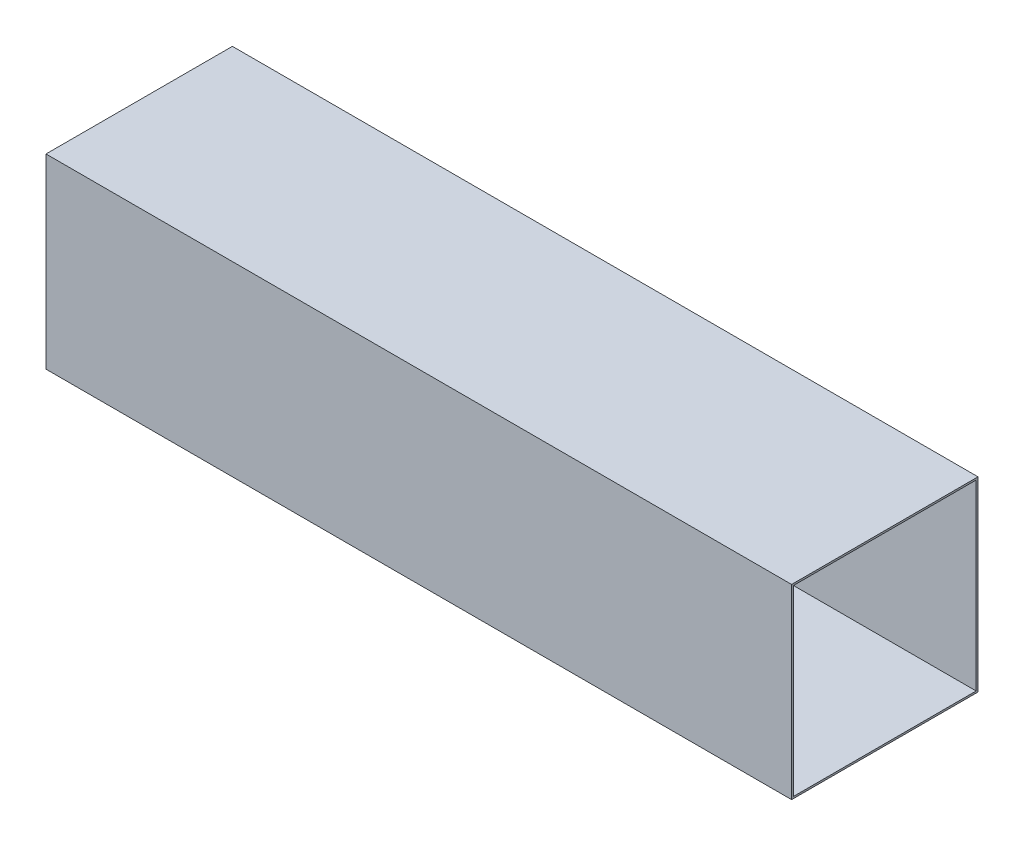
ISO-10303-21;
HEADER;
FILE_DESCRIPTION(('STEP AP214'),'2;1');
FILE_NAME('part.step','',(''),(''),'','','');
FILE_SCHEMA(('AUTOMOTIVE_DESIGN { 1 0 10303 214 1 1 1 1 }'));
ENDSEC;
DATA;
#1=APPLICATION_CONTEXT('core data for automotive mechanical design processes');
#2=APPLICATION_PROTOCOL_DEFINITION('international standard','automotive_design',2000,#1);
#3=PRODUCT_CONTEXT('',#1,'mechanical');
#4=PRODUCT('Part','Part','',(#3));
#5=PRODUCT_RELATED_PRODUCT_CATEGORY('part','',(#4));
#6=PRODUCT_DEFINITION_FORMATION('','',#4);
#7=PRODUCT_DEFINITION_CONTEXT('part definition',#1,'design');
#8=PRODUCT_DEFINITION('design','',#6,#7);
#9=PRODUCT_DEFINITION_SHAPE('','',#8);
#10=(LENGTH_UNIT() NAMED_UNIT(*) SI_UNIT(.MILLI.,.METRE.));
#11=(NAMED_UNIT(*) PLANE_ANGLE_UNIT() SI_UNIT($,.RADIAN.));
#12=(NAMED_UNIT(*) SI_UNIT($,.STERADIAN.) SOLID_ANGLE_UNIT());
#13=UNCERTAINTY_MEASURE_WITH_UNIT(LENGTH_MEASURE(1.E-05),#10,'distance_accuracy_value','');
#14=(GEOMETRIC_REPRESENTATION_CONTEXT(3) GLOBAL_UNCERTAINTY_ASSIGNED_CONTEXT((#13)) GLOBAL_UNIT_ASSIGNED_CONTEXT((#10,
#11,#12)) REPRESENTATION_CONTEXT('',''));
#15=CARTESIAN_POINT('',(0.,0.,0.));
#16=DIRECTION('',(0.,0.,1.));
#17=DIRECTION('',(1.,0.,0.));
#18=AXIS2_PLACEMENT_3D('',#15,#16,#17);
#19=CARTESIAN_POINT('',(400.,0.,0.));
#20=DIRECTION('',(-1.,0.,0.));
#21=DIRECTION('',(0.,0.,1.));
#22=AXIS2_PLACEMENT_3D('',#19,#20,#21);
#23=PLANE('',#22);
#24=DIRECTION('',(0.,-1.,0.));
#25=VECTOR('',#24,1.);
#26=CARTESIAN_POINT('',(400.,0.,0.));
#27=LINE('',#26,#25);
#28=CARTESIAN_POINT('',(400.,100.,0.));
#29=VERTEX_POINT('',#28);
#30=CARTESIAN_POINT('',(400.,0.,0.));
#31=VERTEX_POINT('',#30);
#32=EDGE_CURVE('E133',#29,#31,#27,.T.);
#33=ORIENTED_EDGE('',*,*,#32,.T.);
#34=DIRECTION('',(0.,0.,-1.));
#35=VECTOR('',#34,1.);
#36=CARTESIAN_POINT('',(400.,0.,0.));
#37=LINE('',#36,#35);
#38=CARTESIAN_POINT('',(400.,0.,-100.));
#39=VERTEX_POINT('',#38);
#40=EDGE_CURVE('E136',#31,#39,#37,.T.);
#41=ORIENTED_EDGE('',*,*,#40,.T.);
#42=DIRECTION('',(0.,1.,0.));
#43=VECTOR('',#42,1.);
#44=CARTESIAN_POINT('',(400.,0.,-100.));
#45=LINE('',#44,#43);
#46=CARTESIAN_POINT('',(400.,100.,-100.));
#47=VERTEX_POINT('',#46);
#48=EDGE_CURVE('E139',#39,#47,#45,.T.);
#49=ORIENTED_EDGE('',*,*,#48,.T.);
#50=DIRECTION('',(0.,0.,1.));
#51=VECTOR('',#50,1.);
#52=CARTESIAN_POINT('',(400.,100.,0.));
#53=LINE('',#52,#51);
#54=EDGE_CURVE('E141',#47,#29,#53,.T.);
#55=ORIENTED_EDGE('',*,*,#54,.T.);
#56=EDGE_LOOP('',(#33,#41,#49,#55));
#57=FACE_BOUND('',#56,.T.);
#58=DIRECTION('',(0.,-1.,0.));
#59=VECTOR('',#58,1.);
#60=CARTESIAN_POINT('',(400.,1.,-1.));
#61=LINE('',#60,#59);
#62=CARTESIAN_POINT('',(400.,99.,-1.));
#63=VERTEX_POINT('',#62);
#64=CARTESIAN_POINT('',(400.,1.,-1.));
#65=VERTEX_POINT('',#64);
#66=EDGE_CURVE('E97',#63,#65,#61,.T.);
#67=ORIENTED_EDGE('',*,*,#66,.F.);
#68=DIRECTION('',(0.,0.,1.));
#69=VECTOR('',#68,1.);
#70=CARTESIAN_POINT('',(400.,99.,-1.));
#71=LINE('',#70,#69);
#72=CARTESIAN_POINT('',(400.,99.,-99.));
#73=VERTEX_POINT('',#72);
#74=EDGE_CURVE('E119',#73,#63,#71,.T.);
#75=ORIENTED_EDGE('',*,*,#74,.F.);
#76=DIRECTION('',(0.,1.,0.));
#77=VECTOR('',#76,1.);
#78=CARTESIAN_POINT('',(400.,1.,-99.));
#79=LINE('',#78,#77);
#80=CARTESIAN_POINT('',(400.,1.,-99.));
#81=VERTEX_POINT('',#80);
#82=EDGE_CURVE('E117',#81,#73,#79,.T.);
#83=ORIENTED_EDGE('',*,*,#82,.F.);
#84=DIRECTION('',(0.,0.,-1.));
#85=VECTOR('',#84,1.);
#86=CARTESIAN_POINT('',(400.,1.,-1.));
#87=LINE('',#86,#85);
#88=EDGE_CURVE('E105',#65,#81,#87,.T.);
#89=ORIENTED_EDGE('',*,*,#88,.F.);
#90=EDGE_LOOP('',(#67,#75,#83,#89));
#91=FACE_BOUND('',#90,.T.);
#92=ADVANCED_FACE('F32',(#57,#91),#23,.F.);
#93=CARTESIAN_POINT('',(0.,0.,0.));
#94=DIRECTION('',(-1.,0.,0.));
#95=DIRECTION('',(0.,0.,1.));
#96=AXIS2_PLACEMENT_3D('',#93,#94,#95);
#97=PLANE('',#96);
#98=DIRECTION('',(0.,-1.,0.));
#99=VECTOR('',#98,1.);
#100=CARTESIAN_POINT('',(0.,0.,0.));
#101=LINE('',#100,#99);
#102=CARTESIAN_POINT('',(0.,100.,0.));
#103=VERTEX_POINT('',#102);
#104=CARTESIAN_POINT('',(0.,0.,0.));
#105=VERTEX_POINT('',#104);
#106=EDGE_CURVE('E113',#103,#105,#101,.T.);
#107=ORIENTED_EDGE('',*,*,#106,.F.);
#108=DIRECTION('',(0.,0.,1.));
#109=VECTOR('',#108,1.);
#110=CARTESIAN_POINT('',(0.,100.,0.));
#111=LINE('',#110,#109);
#112=CARTESIAN_POINT('',(0.,100.,-100.));
#113=VERTEX_POINT('',#112);
#114=EDGE_CURVE('E137',#113,#103,#111,.T.);
#115=ORIENTED_EDGE('',*,*,#114,.F.);
#116=DIRECTION('',(0.,1.,0.));
#117=VECTOR('',#116,1.);
#118=CARTESIAN_POINT('',(0.,0.,-100.));
#119=LINE('',#118,#117);
#120=CARTESIAN_POINT('',(0.,0.,-100.));
#121=VERTEX_POINT('',#120);
#122=EDGE_CURVE('E148',#121,#113,#119,.T.);
#123=ORIENTED_EDGE('',*,*,#122,.F.);
#124=DIRECTION('',(0.,0.,-1.));
#125=VECTOR('',#124,1.);
#126=CARTESIAN_POINT('',(0.,0.,0.));
#127=LINE('',#126,#125);
#128=EDGE_CURVE('E146',#105,#121,#127,.T.);
#129=ORIENTED_EDGE('',*,*,#128,.F.);
#130=EDGE_LOOP('',(#107,#115,#123,#129));
#131=FACE_BOUND('',#130,.T.);
#132=DIRECTION('',(0.,0.,1.));
#133=VECTOR('',#132,1.);
#134=CARTESIAN_POINT('',(0.,99.,-1.));
#135=LINE('',#134,#133);
#136=CARTESIAN_POINT('',(0.,99.,-99.));
#137=VERTEX_POINT('',#136);
#138=CARTESIAN_POINT('',(0.,99.,-1.));
#139=VERTEX_POINT('',#138);
#140=EDGE_CURVE('E106',#137,#139,#135,.T.);
#141=ORIENTED_EDGE('',*,*,#140,.T.);
#142=DIRECTION('',(0.,-1.,0.));
#143=VECTOR('',#142,1.);
#144=CARTESIAN_POINT('',(0.,1.,-1.));
#145=LINE('',#144,#143);
#146=CARTESIAN_POINT('',(0.,1.,-1.));
#147=VERTEX_POINT('',#146);
#148=EDGE_CURVE('E55',#139,#147,#145,.T.);
#149=ORIENTED_EDGE('',*,*,#148,.T.);
#150=DIRECTION('',(0.,0.,-1.));
#151=VECTOR('',#150,1.);
#152=CARTESIAN_POINT('',(0.,1.,-1.));
#153=LINE('',#152,#151);
#154=CARTESIAN_POINT('',(0.,1.,-99.));
#155=VERTEX_POINT('',#154);
#156=EDGE_CURVE('E112',#147,#155,#153,.T.);
#157=ORIENTED_EDGE('',*,*,#156,.T.);
#158=DIRECTION('',(0.,1.,0.));
#159=VECTOR('',#158,1.);
#160=CARTESIAN_POINT('',(0.,1.,-99.));
#161=LINE('',#160,#159);
#162=EDGE_CURVE('E125',#155,#137,#161,.T.);
#163=ORIENTED_EDGE('',*,*,#162,.T.);
#164=EDGE_LOOP('',(#141,#149,#157,#163));
#165=FACE_BOUND('',#164,.T.);
#166=ADVANCED_FACE('F166',(#131,#165),#97,.T.);
#167=CARTESIAN_POINT('',(400.,0.,0.));
#168=DIRECTION('',(0.,0.,-1.));
#169=DIRECTION('',(-1.,0.,0.));
#170=AXIS2_PLACEMENT_3D('',#167,#168,#169);
#171=PLANE('',#170);
#172=ORIENTED_EDGE('',*,*,#106,.T.);
#173=DIRECTION('',(-1.,0.,0.));
#174=VECTOR('',#173,1.);
#175=CARTESIAN_POINT('',(400.,0.,0.));
#176=LINE('',#175,#174);
#177=EDGE_CURVE('E11',#31,#105,#176,.T.);
#178=ORIENTED_EDGE('',*,*,#177,.F.);
#179=ORIENTED_EDGE('',*,*,#32,.F.);
#180=DIRECTION('',(-1.,0.,0.));
#181=VECTOR('',#180,1.);
#182=CARTESIAN_POINT('',(400.,100.,0.));
#183=LINE('',#182,#181);
#184=EDGE_CURVE('E143',#29,#103,#183,.T.);
#185=ORIENTED_EDGE('',*,*,#184,.T.);
#186=EDGE_LOOP('',(#172,#178,#179,#185));
#187=FACE_BOUND('',#186,.T.);
#188=ADVANCED_FACE('F34',(#187),#171,.F.);
#189=CARTESIAN_POINT('',(400.,0.,0.));
#190=DIRECTION('',(0.,1.,0.));
#191=DIRECTION('',(0.,0.,1.));
#192=AXIS2_PLACEMENT_3D('',#189,#190,#191);
#193=PLANE('',#192);
#194=ORIENTED_EDGE('',*,*,#128,.T.);
#195=DIRECTION('',(-1.,0.,0.));
#196=VECTOR('',#195,1.);
#197=CARTESIAN_POINT('',(400.,0.,-100.));
#198=LINE('',#197,#196);
#199=EDGE_CURVE('E40',#39,#121,#198,.T.);
#200=ORIENTED_EDGE('',*,*,#199,.F.);
#201=ORIENTED_EDGE('',*,*,#40,.F.);
#202=ORIENTED_EDGE('',*,*,#177,.T.);
#203=EDGE_LOOP('',(#194,#200,#201,#202));
#204=FACE_BOUND('',#203,.T.);
#205=ADVANCED_FACE('F176',(#204),#193,.F.);
#206=CARTESIAN_POINT('',(400.,0.,-100.));
#207=DIRECTION('',(0.,0.,1.));
#208=DIRECTION('',(1.,0.,0.));
#209=AXIS2_PLACEMENT_3D('',#206,#207,#208);
#210=PLANE('',#209);
#211=ORIENTED_EDGE('',*,*,#122,.T.);
#212=DIRECTION('',(-1.,0.,0.));
#213=VECTOR('',#212,1.);
#214=CARTESIAN_POINT('',(400.,100.,-100.));
#215=LINE('',#214,#213);
#216=EDGE_CURVE('E153',#47,#113,#215,.T.);
#217=ORIENTED_EDGE('',*,*,#216,.F.);
#218=ORIENTED_EDGE('',*,*,#48,.F.);
#219=ORIENTED_EDGE('',*,*,#199,.T.);
#220=EDGE_LOOP('',(#211,#217,#218,#219));
#221=FACE_BOUND('',#220,.T.);
#222=ADVANCED_FACE('F160',(#221),#210,.F.);
#223=CARTESIAN_POINT('',(400.,100.,0.));
#224=DIRECTION('',(0.,-1.,0.));
#225=DIRECTION('',(0.,0.,-1.));
#226=AXIS2_PLACEMENT_3D('',#223,#224,#225);
#227=PLANE('',#226);
#228=ORIENTED_EDGE('',*,*,#114,.T.);
#229=ORIENTED_EDGE('',*,*,#184,.F.);
#230=ORIENTED_EDGE('',*,*,#54,.F.);
#231=ORIENTED_EDGE('',*,*,#216,.T.);
#232=EDGE_LOOP('',(#228,#229,#230,#231));
#233=FACE_BOUND('',#232,.T.);
#234=ADVANCED_FACE('F170',(#233),#227,.F.);
#235=CARTESIAN_POINT('',(400.,1.,-1.));
#236=DIRECTION('',(0.,0.,-1.));
#237=DIRECTION('',(-1.,0.,0.));
#238=AXIS2_PLACEMENT_3D('',#235,#236,#237);
#239=PLANE('',#238);
#240=ORIENTED_EDGE('',*,*,#148,.F.);
#241=DIRECTION('',(-1.,0.,0.));
#242=VECTOR('',#241,1.);
#243=CARTESIAN_POINT('',(400.,99.,-1.));
#244=LINE('',#243,#242);
#245=EDGE_CURVE('E101',#63,#139,#244,.T.);
#246=ORIENTED_EDGE('',*,*,#245,.F.);
#247=ORIENTED_EDGE('',*,*,#66,.T.);
#248=DIRECTION('',(-1.,0.,0.));
#249=VECTOR('',#248,1.);
#250=CARTESIAN_POINT('',(400.,1.,-1.));
#251=LINE('',#250,#249);
#252=EDGE_CURVE('E100',#65,#147,#251,.T.);
#253=ORIENTED_EDGE('',*,*,#252,.T.);
#254=EDGE_LOOP('',(#240,#246,#247,#253));
#255=FACE_BOUND('',#254,.T.);
#256=ADVANCED_FACE('F99',(#255),#239,.T.);
#257=CARTESIAN_POINT('',(400.,1.,-1.));
#258=DIRECTION('',(0.,1.,0.));
#259=DIRECTION('',(0.,0.,1.));
#260=AXIS2_PLACEMENT_3D('',#257,#258,#259);
#261=PLANE('',#260);
#262=ORIENTED_EDGE('',*,*,#156,.F.);
#263=ORIENTED_EDGE('',*,*,#252,.F.);
#264=ORIENTED_EDGE('',*,*,#88,.T.);
#265=DIRECTION('',(-1.,0.,0.));
#266=VECTOR('',#265,1.);
#267=CARTESIAN_POINT('',(400.,1.,-99.));
#268=LINE('',#267,#266);
#269=EDGE_CURVE('E114',#81,#155,#268,.T.);
#270=ORIENTED_EDGE('',*,*,#269,.T.);
#271=EDGE_LOOP('',(#262,#263,#264,#270));
#272=FACE_BOUND('',#271,.T.);
#273=ADVANCED_FACE('F109',(#272),#261,.T.);
#274=CARTESIAN_POINT('',(400.,1.,-99.));
#275=DIRECTION('',(0.,0.,1.));
#276=DIRECTION('',(1.,0.,0.));
#277=AXIS2_PLACEMENT_3D('',#274,#275,#276);
#278=PLANE('',#277);
#279=ORIENTED_EDGE('',*,*,#162,.F.);
#280=ORIENTED_EDGE('',*,*,#269,.F.);
#281=ORIENTED_EDGE('',*,*,#82,.T.);
#282=DIRECTION('',(-1.,0.,0.));
#283=VECTOR('',#282,1.);
#284=CARTESIAN_POINT('',(400.,99.,-99.));
#285=LINE('',#284,#283);
#286=EDGE_CURVE('E47',#73,#137,#285,.T.);
#287=ORIENTED_EDGE('',*,*,#286,.T.);
#288=EDGE_LOOP('',(#279,#280,#281,#287));
#289=FACE_BOUND('',#288,.T.);
#290=ADVANCED_FACE('F199',(#289),#278,.T.);
#291=CARTESIAN_POINT('',(400.,99.,-1.));
#292=DIRECTION('',(0.,-1.,0.));
#293=DIRECTION('',(0.,0.,-1.));
#294=AXIS2_PLACEMENT_3D('',#291,#292,#293);
#295=PLANE('',#294);
#296=ORIENTED_EDGE('',*,*,#140,.F.);
#297=ORIENTED_EDGE('',*,*,#286,.F.);
#298=ORIENTED_EDGE('',*,*,#74,.T.);
#299=ORIENTED_EDGE('',*,*,#245,.T.);
#300=EDGE_LOOP('',(#296,#297,#298,#299));
#301=FACE_BOUND('',#300,.T.);
#302=ADVANCED_FACE('F203',(#301),#295,.T.);
#303=CLOSED_SHELL('',(#92,#166,#188,#205,#222,#234,#256,#273,#290,#302));
#304=MANIFOLD_SOLID_BREP('B2',#303);
#305=ADVANCED_BREP_SHAPE_REPRESENTATION('',(#18,#304),#14);
#306=SHAPE_DEFINITION_REPRESENTATION(#9,#305);
ENDSEC;
END-ISO-10303-21;
